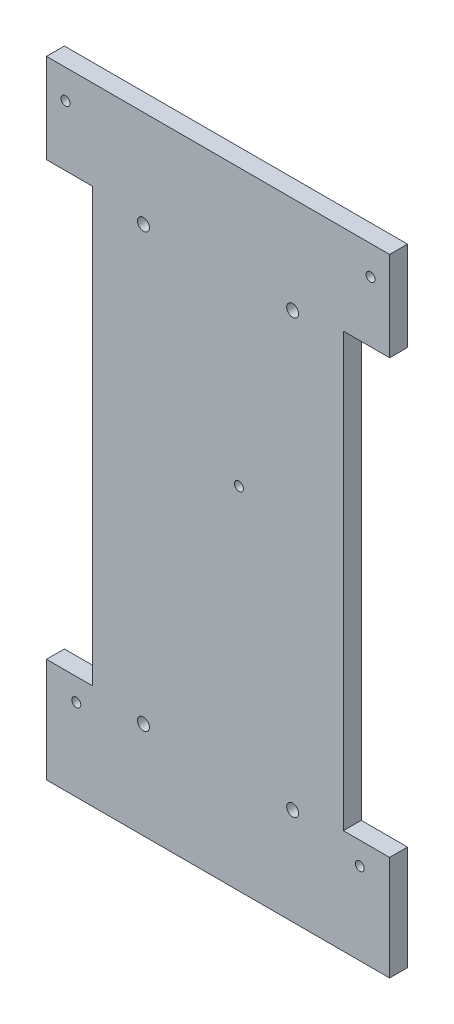
ISO-10303-21;
HEADER;
FILE_DESCRIPTION(('STEP AP214'),'2;1');
FILE_NAME('part.step','',(''),(''),'','','');
FILE_SCHEMA(('AUTOMOTIVE_DESIGN { 1 0 10303 214 1 1 1 1 }'));
ENDSEC;
DATA;
#1=APPLICATION_CONTEXT('core data for automotive mechanical design processes');
#2=APPLICATION_PROTOCOL_DEFINITION('international standard','automotive_design',2000,#1);
#3=PRODUCT_CONTEXT('',#1,'mechanical');
#4=PRODUCT('Part','Part','',(#3));
#5=PRODUCT_RELATED_PRODUCT_CATEGORY('part','',(#4));
#6=PRODUCT_DEFINITION_FORMATION('','',#4);
#7=PRODUCT_DEFINITION_CONTEXT('part definition',#1,'design');
#8=PRODUCT_DEFINITION('design','',#6,#7);
#9=PRODUCT_DEFINITION_SHAPE('','',#8);
#10=(LENGTH_UNIT() NAMED_UNIT(*) SI_UNIT(.MILLI.,.METRE.));
#11=(NAMED_UNIT(*) PLANE_ANGLE_UNIT() SI_UNIT($,.RADIAN.));
#12=(NAMED_UNIT(*) SI_UNIT($,.STERADIAN.) SOLID_ANGLE_UNIT());
#13=UNCERTAINTY_MEASURE_WITH_UNIT(LENGTH_MEASURE(1.E-05),#10,'distance_accuracy_value','');
#14=(GEOMETRIC_REPRESENTATION_CONTEXT(3) GLOBAL_UNCERTAINTY_ASSIGNED_CONTEXT((#13)) GLOBAL_UNIT_ASSIGNED_CONTEXT((#10,
#11,#12)) REPRESENTATION_CONTEXT('',''));
#15=CARTESIAN_POINT('',(0.,0.,0.));
#16=DIRECTION('',(0.,0.,1.));
#17=DIRECTION('',(1.,0.,0.));
#18=AXIS2_PLACEMENT_3D('',#15,#16,#17);
#19=CARTESIAN_POINT('',(0.,99.4374943307562,6.));
#20=DIRECTION('',(0.,-1.,0.));
#21=DIRECTION('',(0.,0.,-1.));
#22=AXIS2_PLACEMENT_3D('',#19,#20,#21);
#23=PLANE('',#22);
#24=DIRECTION('',(-1.,0.,0.));
#25=VECTOR('',#24,1.);
#26=CARTESIAN_POINT('',(0.,99.4374943307562,0.));
#27=LINE('',#26,#25);
#28=CARTESIAN_POINT('',(57.5,99.4374943307562,0.));
#29=VERTEX_POINT('',#28);
#30=CARTESIAN_POINT('',(41.9926373014392,99.4374943307562,0.));
#31=VERTEX_POINT('',#30);
#32=EDGE_CURVE('E183',#29,#31,#27,.T.);
#33=ORIENTED_EDGE('',*,*,#32,.F.);
#34=DIRECTION('',(0.,0.,-1.));
#35=VECTOR('',#34,1.);
#36=CARTESIAN_POINT('',(57.5,99.4374943307562,6.));
#37=LINE('',#36,#35);
#38=CARTESIAN_POINT('',(57.5,99.4374943307562,6.));
#39=VERTEX_POINT('',#38);
#40=EDGE_CURVE('E11',#39,#29,#37,.T.);
#41=ORIENTED_EDGE('',*,*,#40,.F.);
#42=DIRECTION('',(-1.,0.,0.));
#43=VECTOR('',#42,1.);
#44=CARTESIAN_POINT('',(0.,99.4374943307562,6.));
#45=LINE('',#44,#43);
#46=CARTESIAN_POINT('',(41.9926373014392,99.4374943307562,6.));
#47=VERTEX_POINT('',#46);
#48=EDGE_CURVE('E270',#39,#47,#45,.T.);
#49=ORIENTED_EDGE('',*,*,#48,.T.);
#50=DIRECTION('',(0.,0.,-1.));
#51=VECTOR('',#50,1.);
#52=CARTESIAN_POINT('',(41.9926373014392,99.4374943307562,6.));
#53=LINE('',#52,#51);
#54=EDGE_CURVE('E52',#47,#31,#53,.T.);
#55=ORIENTED_EDGE('',*,*,#54,.T.);
#56=EDGE_LOOP('',(#33,#41,#49,#55));
#57=FACE_BOUND('',#56,.T.);
#58=ADVANCED_FACE('F35',(#57),#23,.T.);
#59=CARTESIAN_POINT('',(57.4999999999999,0.,6.));
#60=DIRECTION('',(1.,0.,0.));
#61=DIRECTION('',(0.,1.,0.));
#62=AXIS2_PLACEMENT_3D('',#59,#60,#61);
#63=PLANE('',#62);
#64=DIRECTION('',(0.,-1.,0.));
#65=VECTOR('',#64,1.);
#66=CARTESIAN_POINT('',(57.4999999999999,0.,0.));
#67=LINE('',#66,#65);
#68=CARTESIAN_POINT('',(57.5,129.437494330756,0.));
#69=VERTEX_POINT('',#68);
#70=EDGE_CURVE('E185',#69,#29,#67,.T.);
#71=ORIENTED_EDGE('',*,*,#70,.F.);
#72=DIRECTION('',(0.,0.,-1.));
#73=VECTOR('',#72,1.);
#74=CARTESIAN_POINT('',(57.5,129.437494330756,6.));
#75=LINE('',#74,#73);
#76=CARTESIAN_POINT('',(57.5,129.437494330756,6.));
#77=VERTEX_POINT('',#76);
#78=EDGE_CURVE('E44',#77,#69,#75,.T.);
#79=ORIENTED_EDGE('',*,*,#78,.F.);
#80=DIRECTION('',(0.,-1.,0.));
#81=VECTOR('',#80,1.);
#82=CARTESIAN_POINT('',(57.4999999999999,0.,6.));
#83=LINE('',#82,#81);
#84=EDGE_CURVE('E268',#77,#39,#83,.T.);
#85=ORIENTED_EDGE('',*,*,#84,.T.);
#86=ORIENTED_EDGE('',*,*,#40,.T.);
#87=EDGE_LOOP('',(#71,#79,#85,#86));
#88=FACE_BOUND('',#87,.T.);
#89=ADVANCED_FACE('F254',(#88),#63,.T.);
#90=CARTESIAN_POINT('',(0.,129.437494330756,6.));
#91=DIRECTION('',(0.,1.,0.));
#92=DIRECTION('',(0.,0.,1.));
#93=AXIS2_PLACEMENT_3D('',#90,#91,#92);
#94=PLANE('',#93);
#95=DIRECTION('',(1.,0.,0.));
#96=VECTOR('',#95,1.);
#97=CARTESIAN_POINT('',(0.,129.437494330756,0.));
#98=LINE('',#97,#96);
#99=CARTESIAN_POINT('',(-57.5,129.437494330756,0.));
#100=VERTEX_POINT('',#99);
#101=EDGE_CURVE('E188',#100,#69,#98,.T.);
#102=ORIENTED_EDGE('',*,*,#101,.F.);
#103=DIRECTION('',(0.,0.,-1.));
#104=VECTOR('',#103,1.);
#105=CARTESIAN_POINT('',(-57.5,129.437494330756,6.));
#106=LINE('',#105,#104);
#107=CARTESIAN_POINT('',(-57.5,129.437494330756,6.));
#108=VERTEX_POINT('',#107);
#109=EDGE_CURVE('E243',#108,#100,#106,.T.);
#110=ORIENTED_EDGE('',*,*,#109,.F.);
#111=DIRECTION('',(1.,0.,0.));
#112=VECTOR('',#111,1.);
#113=CARTESIAN_POINT('',(0.,129.437494330756,6.));
#114=LINE('',#113,#112);
#115=EDGE_CURVE('E250',#108,#77,#114,.T.);
#116=ORIENTED_EDGE('',*,*,#115,.T.);
#117=ORIENTED_EDGE('',*,*,#78,.T.);
#118=EDGE_LOOP('',(#102,#110,#116,#117));
#119=FACE_BOUND('',#118,.T.);
#120=ADVANCED_FACE('F248',(#119),#94,.T.);
#121=CARTESIAN_POINT('',(-57.4999999999999,0.,6.));
#122=DIRECTION('',(1.,0.,0.));
#123=DIRECTION('',(0.,1.,0.));
#124=AXIS2_PLACEMENT_3D('',#121,#122,#123);
#125=PLANE('',#124);
#126=DIRECTION('',(0.,-1.,0.));
#127=VECTOR('',#126,1.);
#128=CARTESIAN_POINT('',(-57.4999999999999,0.,0.));
#129=LINE('',#128,#127);
#130=CARTESIAN_POINT('',(-57.5,99.4374943307562,0.));
#131=VERTEX_POINT('',#130);
#132=EDGE_CURVE('E191',#100,#131,#129,.T.);
#133=ORIENTED_EDGE('',*,*,#132,.T.);
#134=DIRECTION('',(0.,0.,-1.));
#135=VECTOR('',#134,1.);
#136=CARTESIAN_POINT('',(-57.5,99.4374943307562,6.));
#137=LINE('',#136,#135);
#138=CARTESIAN_POINT('',(-57.5,99.4374943307562,6.));
#139=VERTEX_POINT('',#138);
#140=EDGE_CURVE('E240',#139,#131,#137,.T.);
#141=ORIENTED_EDGE('',*,*,#140,.F.);
#142=DIRECTION('',(0.,-1.,0.));
#143=VECTOR('',#142,1.);
#144=CARTESIAN_POINT('',(-57.4999999999999,0.,6.));
#145=LINE('',#144,#143);
#146=EDGE_CURVE('E264',#108,#139,#145,.T.);
#147=ORIENTED_EDGE('',*,*,#146,.F.);
#148=ORIENTED_EDGE('',*,*,#109,.T.);
#149=EDGE_LOOP('',(#133,#141,#147,#148));
#150=FACE_BOUND('',#149,.T.);
#151=ADVANCED_FACE('F261',(#150),#125,.F.);
#152=CARTESIAN_POINT('',(0.,99.4374943307562,6.));
#153=DIRECTION('',(0.,1.,0.));
#154=DIRECTION('',(0.,0.,1.));
#155=AXIS2_PLACEMENT_3D('',#152,#153,#154);
#156=PLANE('',#155);
#157=DIRECTION('',(1.,0.,0.));
#158=VECTOR('',#157,1.);
#159=CARTESIAN_POINT('',(0.,99.4374943307562,0.));
#160=LINE('',#159,#158);
#161=CARTESIAN_POINT('',(-41.9926373014392,99.4374943307562,0.));
#162=VERTEX_POINT('',#161);
#163=EDGE_CURVE('E194',#131,#162,#160,.T.);
#164=ORIENTED_EDGE('',*,*,#163,.T.);
#165=DIRECTION('',(0.,0.,-1.));
#166=VECTOR('',#165,1.);
#167=CARTESIAN_POINT('',(-41.9926373014392,99.4374943307562,6.));
#168=LINE('',#167,#166);
#169=CARTESIAN_POINT('',(-41.9926373014392,99.4374943307562,6.));
#170=VERTEX_POINT('',#169);
#171=EDGE_CURVE('E237',#170,#162,#168,.T.);
#172=ORIENTED_EDGE('',*,*,#171,.F.);
#173=DIRECTION('',(1.,0.,0.));
#174=VECTOR('',#173,1.);
#175=CARTESIAN_POINT('',(0.,99.4374943307562,6.));
#176=LINE('',#175,#174);
#177=EDGE_CURVE('E266',#139,#170,#176,.T.);
#178=ORIENTED_EDGE('',*,*,#177,.F.);
#179=ORIENTED_EDGE('',*,*,#140,.T.);
#180=EDGE_LOOP('',(#164,#172,#178,#179));
#181=FACE_BOUND('',#180,.T.);
#182=ADVANCED_FACE('F480',(#181),#156,.F.);
#183=CARTESIAN_POINT('',(-41.9926373014392,0.,6.));
#184=DIRECTION('',(1.,0.,0.));
#185=DIRECTION('',(0.,1.,0.));
#186=AXIS2_PLACEMENT_3D('',#183,#184,#185);
#187=PLANE('',#186);
#188=DIRECTION('',(0.,-1.,0.));
#189=VECTOR('',#188,1.);
#190=CARTESIAN_POINT('',(-41.9926373014392,0.,0.));
#191=LINE('',#190,#189);
#192=CARTESIAN_POINT('',(-41.9926373014392,-45.5625056692438,0.));
#193=VERTEX_POINT('',#192);
#194=EDGE_CURVE('E197',#162,#193,#191,.T.);
#195=ORIENTED_EDGE('',*,*,#194,.T.);
#196=DIRECTION('',(0.,0.,-1.));
#197=VECTOR('',#196,1.);
#198=CARTESIAN_POINT('',(-41.9926373014392,-45.5625056692438,6.));
#199=LINE('',#198,#197);
#200=CARTESIAN_POINT('',(-41.9926373014392,-45.5625056692438,6.));
#201=VERTEX_POINT('',#200);
#202=EDGE_CURVE('E235',#201,#193,#199,.T.);
#203=ORIENTED_EDGE('',*,*,#202,.F.);
#204=DIRECTION('',(0.,-1.,0.));
#205=VECTOR('',#204,1.);
#206=CARTESIAN_POINT('',(-41.9926373014392,0.,6.));
#207=LINE('',#206,#205);
#208=EDGE_CURVE('E275',#170,#201,#207,.T.);
#209=ORIENTED_EDGE('',*,*,#208,.F.);
#210=ORIENTED_EDGE('',*,*,#171,.T.);
#211=EDGE_LOOP('',(#195,#203,#209,#210));
#212=FACE_BOUND('',#211,.T.);
#213=ADVANCED_FACE('F470',(#212),#187,.F.);
#214=CARTESIAN_POINT('',(0.,-45.5625056692438,6.));
#215=DIRECTION('',(0.,1.,0.));
#216=DIRECTION('',(0.,0.,1.));
#217=AXIS2_PLACEMENT_3D('',#214,#215,#216);
#218=PLANE('',#217);
#219=DIRECTION('',(1.,0.,0.));
#220=VECTOR('',#219,1.);
#221=CARTESIAN_POINT('',(0.,-45.5625056692438,0.));
#222=LINE('',#221,#220);
#223=CARTESIAN_POINT('',(-57.4999999999999,-45.5625056692438,0.));
#224=VERTEX_POINT('',#223);
#225=EDGE_CURVE('E200',#224,#193,#222,.T.);
#226=ORIENTED_EDGE('',*,*,#225,.F.);
#227=DIRECTION('',(0.,0.,-1.));
#228=VECTOR('',#227,1.);
#229=CARTESIAN_POINT('',(-57.4999999999999,-45.5625056692438,6.));
#230=LINE('',#229,#228);
#231=CARTESIAN_POINT('',(-57.4999999999999,-45.5625056692438,6.));
#232=VERTEX_POINT('',#231);
#233=EDGE_CURVE('E233',#232,#224,#230,.T.);
#234=ORIENTED_EDGE('',*,*,#233,.F.);
#235=DIRECTION('',(1.,0.,0.));
#236=VECTOR('',#235,1.);
#237=CARTESIAN_POINT('',(0.,-45.5625056692438,6.));
#238=LINE('',#237,#236);
#239=EDGE_CURVE('E277',#232,#201,#238,.T.);
#240=ORIENTED_EDGE('',*,*,#239,.T.);
#241=ORIENTED_EDGE('',*,*,#202,.T.);
#242=EDGE_LOOP('',(#226,#234,#240,#241));
#243=FACE_BOUND('',#242,.T.);
#244=ADVANCED_FACE('F287',(#243),#218,.T.);
#245=CARTESIAN_POINT('',(-57.4999999999999,0.,6.));
#246=DIRECTION('',(-1.,0.,0.));
#247=DIRECTION('',(0.,-1.,0.));
#248=AXIS2_PLACEMENT_3D('',#245,#246,#247);
#249=PLANE('',#248);
#250=DIRECTION('',(0.,1.,0.));
#251=VECTOR('',#250,1.);
#252=CARTESIAN_POINT('',(-57.4999999999999,0.,0.));
#253=LINE('',#252,#251);
#254=CARTESIAN_POINT('',(-57.5,-80.5625056692438,0.));
#255=VERTEX_POINT('',#254);
#256=EDGE_CURVE('E203',#255,#224,#253,.T.);
#257=ORIENTED_EDGE('',*,*,#256,.F.);
#258=DIRECTION('',(0.,0.,-1.));
#259=VECTOR('',#258,1.);
#260=CARTESIAN_POINT('',(-57.5,-80.5625056692438,6.));
#261=LINE('',#260,#259);
#262=CARTESIAN_POINT('',(-57.5,-80.5625056692438,6.));
#263=VERTEX_POINT('',#262);
#264=EDGE_CURVE('E231',#263,#255,#261,.T.);
#265=ORIENTED_EDGE('',*,*,#264,.F.);
#266=DIRECTION('',(0.,1.,0.));
#267=VECTOR('',#266,1.);
#268=CARTESIAN_POINT('',(-57.4999999999999,0.,6.));
#269=LINE('',#268,#267);
#270=EDGE_CURVE('E151',#263,#232,#269,.T.);
#271=ORIENTED_EDGE('',*,*,#270,.T.);
#272=ORIENTED_EDGE('',*,*,#233,.T.);
#273=EDGE_LOOP('',(#257,#265,#271,#272));
#274=FACE_BOUND('',#273,.T.);
#275=ADVANCED_FACE('F282',(#274),#249,.T.);
#276=CARTESIAN_POINT('',(0.,-80.5625056692438,6.));
#277=DIRECTION('',(0.,1.,0.));
#278=DIRECTION('',(-1.,0.,0.));
#279=AXIS2_PLACEMENT_3D('',#276,#277,#278);
#280=PLANE('',#279);
#281=DIRECTION('',(1.,0.,0.));
#282=VECTOR('',#281,1.);
#283=CARTESIAN_POINT('',(0.,-80.5625056692438,0.));
#284=LINE('',#283,#282);
#285=CARTESIAN_POINT('',(57.5000000000001,-80.5625056692438,0.));
#286=VERTEX_POINT('',#285);
#287=EDGE_CURVE('E206',#255,#286,#284,.T.);
#288=ORIENTED_EDGE('',*,*,#287,.T.);
#289=DIRECTION('',(0.,0.,-1.));
#290=VECTOR('',#289,1.);
#291=CARTESIAN_POINT('',(57.5000000000001,-80.5625056692438,6.));
#292=LINE('',#291,#290);
#293=CARTESIAN_POINT('',(57.5000000000001,-80.5625056692438,6.));
#294=VERTEX_POINT('',#293);
#295=EDGE_CURVE('E136',#294,#286,#292,.T.);
#296=ORIENTED_EDGE('',*,*,#295,.F.);
#297=DIRECTION('',(1.,0.,0.));
#298=VECTOR('',#297,1.);
#299=CARTESIAN_POINT('',(0.,-80.5625056692438,6.));
#300=LINE('',#299,#298);
#301=EDGE_CURVE('E148',#263,#294,#300,.T.);
#302=ORIENTED_EDGE('',*,*,#301,.F.);
#303=ORIENTED_EDGE('',*,*,#264,.T.);
#304=EDGE_LOOP('',(#288,#296,#302,#303));
#305=FACE_BOUND('',#304,.T.);
#306=ADVANCED_FACE('F290',(#305),#280,.F.);
#307=CARTESIAN_POINT('',(57.4999999999999,1.48194948376304E-13,6.));
#308=DIRECTION('',(1.,0.,0.));
#309=DIRECTION('',(0.,1.,0.));
#310=AXIS2_PLACEMENT_3D('',#307,#308,#309);
#311=PLANE('',#310);
#312=DIRECTION('',(0.,-1.,0.));
#313=VECTOR('',#312,1.);
#314=CARTESIAN_POINT('',(57.4999999999999,1.48194948376304E-13,0.));
#315=LINE('',#314,#313);
#316=CARTESIAN_POINT('',(57.5,-45.5625056692438,0.));
#317=VERTEX_POINT('',#316);
#318=EDGE_CURVE('E133',#317,#286,#315,.T.);
#319=ORIENTED_EDGE('',*,*,#318,.F.);
#320=DIRECTION('',(0.,0.,-1.));
#321=VECTOR('',#320,1.);
#322=CARTESIAN_POINT('',(57.5,-45.5625056692438,6.));
#323=LINE('',#322,#321);
#324=CARTESIAN_POINT('',(57.5,-45.5625056692438,6.));
#325=VERTEX_POINT('',#324);
#326=EDGE_CURVE('E127',#325,#317,#323,.T.);
#327=ORIENTED_EDGE('',*,*,#326,.F.);
#328=DIRECTION('',(0.,-1.,0.));
#329=VECTOR('',#328,1.);
#330=CARTESIAN_POINT('',(57.4999999999999,1.48194948376304E-13,6.));
#331=LINE('',#330,#329);
#332=EDGE_CURVE('E131',#325,#294,#331,.T.);
#333=ORIENTED_EDGE('',*,*,#332,.T.);
#334=ORIENTED_EDGE('',*,*,#295,.T.);
#335=EDGE_LOOP('',(#319,#327,#333,#334));
#336=FACE_BOUND('',#335,.T.);
#337=ADVANCED_FACE('F129',(#336),#311,.T.);
#338=CARTESIAN_POINT('',(0.,-45.5625056692438,6.));
#339=DIRECTION('',(0.,-1.,0.));
#340=DIRECTION('',(0.,0.,-1.));
#341=AXIS2_PLACEMENT_3D('',#338,#339,#340);
#342=PLANE('',#341);
#343=DIRECTION('',(-1.,0.,0.));
#344=VECTOR('',#343,1.);
#345=CARTESIAN_POINT('',(0.,-45.5625056692438,0.));
#346=LINE('',#345,#344);
#347=CARTESIAN_POINT('',(41.9926373014392,-45.5625056692438,0.));
#348=VERTEX_POINT('',#347);
#349=EDGE_CURVE('E210',#317,#348,#346,.T.);
#350=ORIENTED_EDGE('',*,*,#349,.T.);
#351=DIRECTION('',(0.,0.,-1.));
#352=VECTOR('',#351,1.);
#353=CARTESIAN_POINT('',(41.9926373014392,-45.5625056692438,6.));
#354=LINE('',#353,#352);
#355=CARTESIAN_POINT('',(41.9926373014392,-45.5625056692438,6.));
#356=VERTEX_POINT('',#355);
#357=EDGE_CURVE('E90',#356,#348,#354,.T.);
#358=ORIENTED_EDGE('',*,*,#357,.F.);
#359=DIRECTION('',(-1.,0.,0.));
#360=VECTOR('',#359,1.);
#361=CARTESIAN_POINT('',(0.,-45.5625056692438,6.));
#362=LINE('',#361,#360);
#363=EDGE_CURVE('E138',#325,#356,#362,.T.);
#364=ORIENTED_EDGE('',*,*,#363,.F.);
#365=ORIENTED_EDGE('',*,*,#326,.T.);
#366=EDGE_LOOP('',(#350,#358,#364,#365));
#367=FACE_BOUND('',#366,.T.);
#368=ADVANCED_FACE('F139',(#367),#342,.F.);
#369=CARTESIAN_POINT('',(-24.9999999999999,-48.0625056692438,6.));
#370=DIRECTION('',(0.,0.,-1.));
#371=DIRECTION('',(-1.,0.,0.));
#372=AXIS2_PLACEMENT_3D('',#369,#370,#371);
#373=CYLINDRICAL_SURFACE('',#372,2.);
#374=CARTESIAN_POINT('',(-24.9999999999999,-48.0625056692438,6.));
#375=DIRECTION('',(0.,0.,1.));
#376=DIRECTION('',(1.,0.,0.));
#377=AXIS2_PLACEMENT_3D('',#374,#375,#376);
#378=CIRCLE('',#377,2.);
#379=CARTESIAN_POINT('',(-22.9999999999999,-48.0625056692438,6.));
#380=VERTEX_POINT('',#379);
#381=EDGE_CURVE('E162',#380,#380,#378,.T.);
#382=ORIENTED_EDGE('',*,*,#381,.T.);
#383=EDGE_LOOP('',(#382));
#384=FACE_BOUND('',#383,.T.);
#385=CARTESIAN_POINT('',(-24.9999999999999,-48.0625056692438,0.));
#386=DIRECTION('',(0.,0.,1.));
#387=DIRECTION('',(1.,0.,0.));
#388=AXIS2_PLACEMENT_3D('',#385,#386,#387);
#389=CIRCLE('',#388,2.);
#390=CARTESIAN_POINT('',(-22.9999999999999,-48.0625056692438,0.));
#391=VERTEX_POINT('',#390);
#392=EDGE_CURVE('E221',#391,#391,#389,.T.);
#393=ORIENTED_EDGE('',*,*,#392,.F.);
#394=EDGE_LOOP('',(#393));
#395=FACE_BOUND('',#394,.T.);
#396=ADVANCED_FACE('F354',(#384,#395),#373,.F.);
#397=CARTESIAN_POINT('',(47.5,-53.0625056692438,6.));
#398=DIRECTION('',(0.,0.,-1.));
#399=DIRECTION('',(-1.,0.,0.));
#400=AXIS2_PLACEMENT_3D('',#397,#398,#399);
#401=CYLINDRICAL_SURFACE('',#400,1.5);
#402=CARTESIAN_POINT('',(47.5,-53.0625056692438,6.));
#403=DIRECTION('',(0.,0.,1.));
#404=DIRECTION('',(1.,0.,0.));
#405=AXIS2_PLACEMENT_3D('',#402,#403,#404);
#406=CIRCLE('',#405,1.5);
#407=CARTESIAN_POINT('',(49.,-53.0625056692438,6.));
#408=VERTEX_POINT('',#407);
#409=EDGE_CURVE('E159',#408,#408,#406,.F.);
#410=ORIENTED_EDGE('',*,*,#409,.F.);
#411=EDGE_LOOP('',(#410));
#412=FACE_BOUND('',#411,.T.);
#413=CARTESIAN_POINT('',(47.5,-53.0625056692438,0.));
#414=DIRECTION('',(0.,0.,1.));
#415=DIRECTION('',(1.,0.,0.));
#416=AXIS2_PLACEMENT_3D('',#413,#414,#415);
#417=CIRCLE('',#416,1.5);
#418=CARTESIAN_POINT('',(49.,-53.0625056692438,0.));
#419=VERTEX_POINT('',#418);
#420=EDGE_CURVE('E218',#419,#419,#417,.F.);
#421=ORIENTED_EDGE('',*,*,#420,.T.);
#422=EDGE_LOOP('',(#421));
#423=FACE_BOUND('',#422,.T.);
#424=ADVANCED_FACE('F357',(#412,#423),#401,.F.);
#425=CARTESIAN_POINT('',(-47.5,-53.0625056692438,6.));
#426=DIRECTION('',(0.,0.,-1.));
#427=DIRECTION('',(-1.,0.,0.));
#428=AXIS2_PLACEMENT_3D('',#425,#426,#427);
#429=CYLINDRICAL_SURFACE('',#428,1.5);
#430=CARTESIAN_POINT('',(-47.5,-53.0625056692438,6.));
#431=DIRECTION('',(0.,0.,1.));
#432=DIRECTION('',(1.,0.,0.));
#433=AXIS2_PLACEMENT_3D('',#430,#431,#432);
#434=CIRCLE('',#433,1.5);
#435=CARTESIAN_POINT('',(-46.,-53.0625056692438,6.));
#436=VERTEX_POINT('',#435);
#437=EDGE_CURVE('E156',#436,#436,#434,.T.);
#438=ORIENTED_EDGE('',*,*,#437,.T.);
#439=EDGE_LOOP('',(#438));
#440=FACE_BOUND('',#439,.T.);
#441=CARTESIAN_POINT('',(-47.5,-53.0625056692438,0.));
#442=DIRECTION('',(0.,0.,1.));
#443=DIRECTION('',(1.,0.,0.));
#444=AXIS2_PLACEMENT_3D('',#441,#442,#443);
#445=CIRCLE('',#444,1.5);
#446=CARTESIAN_POINT('',(-46.,-53.0625056692438,0.));
#447=VERTEX_POINT('',#446);
#448=EDGE_CURVE('E215',#447,#447,#445,.T.);
#449=ORIENTED_EDGE('',*,*,#448,.F.);
#450=EDGE_LOOP('',(#449));
#451=FACE_BOUND('',#450,.T.);
#452=ADVANCED_FACE('F361',(#440,#451),#429,.F.);
#453=CARTESIAN_POINT('',(41.9926373014392,0.,6.));
#454=DIRECTION('',(1.,0.,0.));
#455=DIRECTION('',(0.,1.,0.));
#456=AXIS2_PLACEMENT_3D('',#453,#454,#455);
#457=PLANE('',#456);
#458=DIRECTION('',(0.,-1.,0.));
#459=VECTOR('',#458,1.);
#460=CARTESIAN_POINT('',(41.9926373014392,0.,0.));
#461=LINE('',#460,#459);
#462=EDGE_CURVE('E212',#31,#348,#461,.T.);
#463=ORIENTED_EDGE('',*,*,#462,.F.);
#464=ORIENTED_EDGE('',*,*,#54,.F.);
#465=DIRECTION('',(0.,-1.,0.));
#466=VECTOR('',#465,1.);
#467=CARTESIAN_POINT('',(41.9926373014392,0.,6.));
#468=LINE('',#467,#466);
#469=EDGE_CURVE('E142',#47,#356,#468,.T.);
#470=ORIENTED_EDGE('',*,*,#469,.T.);
#471=ORIENTED_EDGE('',*,*,#357,.T.);
#472=EDGE_LOOP('',(#463,#464,#470,#471));
#473=FACE_BOUND('',#472,.T.);
#474=ADVANCED_FACE('F311',(#473),#457,.T.);
#475=CARTESIAN_POINT('',(-51.1056480309251,119.710621144413,6.));
#476=DIRECTION('',(0.,0.,-1.));
#477=DIRECTION('',(-1.,0.,0.));
#478=AXIS2_PLACEMENT_3D('',#475,#476,#477);
#479=CYLINDRICAL_SURFACE('',#478,1.5);
#480=CARTESIAN_POINT('',(-51.1056480309251,119.710621144413,6.));
#481=DIRECTION('',(0.,0.,1.));
#482=DIRECTION('',(1.,0.,0.));
#483=AXIS2_PLACEMENT_3D('',#480,#481,#482);
#484=CIRCLE('',#483,1.5);
#485=CARTESIAN_POINT('',(-49.6056480309251,119.710621144413,6.));
#486=VERTEX_POINT('',#485);
#487=EDGE_CURVE('E577',#486,#486,#484,.T.);
#488=ORIENTED_EDGE('',*,*,#487,.T.);
#489=EDGE_LOOP('',(#488));
#490=FACE_BOUND('',#489,.T.);
#491=CARTESIAN_POINT('',(-51.1056480309251,119.710621144413,0.));
#492=DIRECTION('',(0.,0.,1.));
#493=DIRECTION('',(1.,0.,0.));
#494=AXIS2_PLACEMENT_3D('',#491,#492,#493);
#495=CIRCLE('',#494,1.5);
#496=CARTESIAN_POINT('',(-49.6056480309251,119.710621144413,0.));
#497=VERTEX_POINT('',#496);
#498=EDGE_CURVE('E180',#497,#497,#495,.T.);
#499=ORIENTED_EDGE('',*,*,#498,.F.);
#500=EDGE_LOOP('',(#499));
#501=FACE_BOUND('',#500,.T.);
#502=ADVANCED_FACE('F307',(#490,#501),#479,.F.);
#503=CARTESIAN_POINT('',(51.1056480309252,119.710621144414,6.));
#504=DIRECTION('',(0.,0.,-1.));
#505=DIRECTION('',(-1.,0.,0.));
#506=AXIS2_PLACEMENT_3D('',#503,#504,#505);
#507=CYLINDRICAL_SURFACE('',#506,1.5);
#508=CARTESIAN_POINT('',(51.1056480309252,119.710621144414,6.));
#509=DIRECTION('',(0.,0.,1.));
#510=DIRECTION('',(1.,0.,0.));
#511=AXIS2_PLACEMENT_3D('',#508,#509,#510);
#512=CIRCLE('',#511,1.5);
#513=CARTESIAN_POINT('',(52.6056480309252,119.710621144414,6.));
#514=VERTEX_POINT('',#513);
#515=EDGE_CURVE('E574',#514,#514,#512,.F.);
#516=ORIENTED_EDGE('',*,*,#515,.F.);
#517=EDGE_LOOP('',(#516));
#518=FACE_BOUND('',#517,.T.);
#519=CARTESIAN_POINT('',(51.1056480309252,119.710621144414,0.));
#520=DIRECTION('',(0.,0.,1.));
#521=DIRECTION('',(1.,0.,0.));
#522=AXIS2_PLACEMENT_3D('',#519,#520,#521);
#523=CIRCLE('',#522,1.5);
#524=CARTESIAN_POINT('',(52.6056480309252,119.710621144414,0.));
#525=VERTEX_POINT('',#524);
#526=EDGE_CURVE('E177',#525,#525,#523,.F.);
#527=ORIENTED_EDGE('',*,*,#526,.T.);
#528=EDGE_LOOP('',(#527));
#529=FACE_BOUND('',#528,.T.);
#530=ADVANCED_FACE('F310',(#518,#529),#507,.F.);
#531=CARTESIAN_POINT('',(-25.,96.9392871585198,6.));
#532=DIRECTION('',(0.,0.,-1.));
#533=DIRECTION('',(-1.,0.,0.));
#534=AXIS2_PLACEMENT_3D('',#531,#532,#533);
#535=CYLINDRICAL_SURFACE('',#534,2.);
#536=CARTESIAN_POINT('',(-25.,96.9392871585198,6.));
#537=DIRECTION('',(0.,0.,1.));
#538=DIRECTION('',(1.,0.,0.));
#539=AXIS2_PLACEMENT_3D('',#536,#537,#538);
#540=CIRCLE('',#539,2.);
#541=CARTESIAN_POINT('',(-23.,96.9392871585198,6.));
#542=VERTEX_POINT('',#541);
#543=EDGE_CURVE('E570',#542,#542,#540,.T.);
#544=ORIENTED_EDGE('',*,*,#543,.T.);
#545=EDGE_LOOP('',(#544));
#546=FACE_BOUND('',#545,.T.);
#547=CARTESIAN_POINT('',(-25.,96.9392871585198,0.));
#548=DIRECTION('',(0.,0.,1.));
#549=DIRECTION('',(1.,0.,0.));
#550=AXIS2_PLACEMENT_3D('',#547,#548,#549);
#551=CIRCLE('',#550,2.);
#552=CARTESIAN_POINT('',(-23.,96.9392871585198,0.));
#553=VERTEX_POINT('',#552);
#554=EDGE_CURVE('E174',#553,#553,#551,.T.);
#555=ORIENTED_EDGE('',*,*,#554,.F.);
#556=EDGE_LOOP('',(#555));
#557=FACE_BOUND('',#556,.T.);
#558=ADVANCED_FACE('F315',(#546,#557),#535,.F.);
#559=CARTESIAN_POINT('',(25.,96.9392871585198,6.));
#560=DIRECTION('',(0.,0.,-1.));
#561=DIRECTION('',(-1.,0.,0.));
#562=AXIS2_PLACEMENT_3D('',#559,#560,#561);
#563=CYLINDRICAL_SURFACE('',#562,2.);
#564=CARTESIAN_POINT('',(25.,96.9392871585198,6.));
#565=DIRECTION('',(0.,0.,1.));
#566=DIRECTION('',(1.,0.,0.));
#567=AXIS2_PLACEMENT_3D('',#564,#565,#566);
#568=CIRCLE('',#567,2.);
#569=CARTESIAN_POINT('',(27.,96.9392871585198,6.));
#570=VERTEX_POINT('',#569);
#571=EDGE_CURVE('E330',#570,#570,#568,.F.);
#572=ORIENTED_EDGE('',*,*,#571,.F.);
#573=EDGE_LOOP('',(#572));
#574=FACE_BOUND('',#573,.T.);
#575=CARTESIAN_POINT('',(25.,96.9392871585198,0.));
#576=DIRECTION('',(0.,0.,1.));
#577=DIRECTION('',(1.,0.,0.));
#578=AXIS2_PLACEMENT_3D('',#575,#576,#577);
#579=CIRCLE('',#578,2.);
#580=CARTESIAN_POINT('',(27.,96.9392871585198,0.));
#581=VERTEX_POINT('',#580);
#582=EDGE_CURVE('E171',#581,#581,#579,.F.);
#583=ORIENTED_EDGE('',*,*,#582,.T.);
#584=EDGE_LOOP('',(#583));
#585=FACE_BOUND('',#584,.T.);
#586=ADVANCED_FACE('F318',(#574,#585),#563,.F.);
#587=CARTESIAN_POINT('',(7.00000000000005,36.9374943307562,6.));
#588=DIRECTION('',(0.,0.,-1.));
#589=DIRECTION('',(-1.,0.,0.));
#590=AXIS2_PLACEMENT_3D('',#587,#588,#589);
#591=CYLINDRICAL_SURFACE('',#590,1.5);
#592=CARTESIAN_POINT('',(7.00000000000005,36.9374943307562,6.));
#593=DIRECTION('',(0.,0.,1.));
#594=DIRECTION('',(1.,0.,0.));
#595=AXIS2_PLACEMENT_3D('',#592,#593,#594);
#596=CIRCLE('',#595,1.5);
#597=CARTESIAN_POINT('',(8.50000000000005,36.9374943307562,6.));
#598=VERTEX_POINT('',#597);
#599=EDGE_CURVE('E227',#598,#598,#596,.T.);
#600=ORIENTED_EDGE('',*,*,#599,.T.);
#601=EDGE_LOOP('',(#600));
#602=FACE_BOUND('',#601,.T.);
#603=CARTESIAN_POINT('',(7.00000000000005,36.9374943307562,0.));
#604=DIRECTION('',(0.,0.,1.));
#605=DIRECTION('',(1.,0.,0.));
#606=AXIS2_PLACEMENT_3D('',#603,#604,#605);
#607=CIRCLE('',#606,1.5);
#608=CARTESIAN_POINT('',(8.50000000000005,36.9374943307562,0.));
#609=VERTEX_POINT('',#608);
#610=EDGE_CURVE('E168',#609,#609,#607,.T.);
#611=ORIENTED_EDGE('',*,*,#610,.F.);
#612=EDGE_LOOP('',(#611));
#613=FACE_BOUND('',#612,.T.);
#614=ADVANCED_FACE('F37',(#602,#613),#591,.F.);
#615=CARTESIAN_POINT('',(25.,-48.0625056692438,6.));
#616=DIRECTION('',(0.,0.,-1.));
#617=DIRECTION('',(-1.,0.,0.));
#618=AXIS2_PLACEMENT_3D('',#615,#616,#617);
#619=CYLINDRICAL_SURFACE('',#618,2.);
#620=CARTESIAN_POINT('',(25.,-48.0625056692438,6.));
#621=DIRECTION('',(0.,0.,1.));
#622=DIRECTION('',(1.,0.,0.));
#623=AXIS2_PLACEMENT_3D('',#620,#621,#622);
#624=CIRCLE('',#623,2.);
#625=CARTESIAN_POINT('',(27.,-48.0625056692438,6.));
#626=VERTEX_POINT('',#625);
#627=EDGE_CURVE('E165',#626,#626,#624,.F.);
#628=ORIENTED_EDGE('',*,*,#627,.F.);
#629=EDGE_LOOP('',(#628));
#630=FACE_BOUND('',#629,.T.);
#631=CARTESIAN_POINT('',(25.,-48.0625056692438,0.));
#632=DIRECTION('',(0.,0.,1.));
#633=DIRECTION('',(1.,0.,0.));
#634=AXIS2_PLACEMENT_3D('',#631,#632,#633);
#635=CIRCLE('',#634,2.);
#636=CARTESIAN_POINT('',(27.,-48.0625056692438,0.));
#637=VERTEX_POINT('',#636);
#638=EDGE_CURVE('E224',#637,#637,#635,.F.);
#639=ORIENTED_EDGE('',*,*,#638,.T.);
#640=EDGE_LOOP('',(#639));
#641=FACE_BOUND('',#640,.T.);
#642=ADVANCED_FACE('F325',(#630,#641),#619,.F.);
#643=CARTESIAN_POINT('',(0.,0.,6.));
#644=DIRECTION('',(0.,0.,1.));
#645=DIRECTION('',(1.,0.,0.));
#646=AXIS2_PLACEMENT_3D('',#643,#644,#645);
#647=PLANE('',#646);
#648=ORIENTED_EDGE('',*,*,#599,.F.);
#649=EDGE_LOOP('',(#648));
#650=FACE_BOUND('',#649,.T.);
#651=ORIENTED_EDGE('',*,*,#571,.T.);
#652=EDGE_LOOP('',(#651));
#653=FACE_BOUND('',#652,.T.);
#654=ORIENTED_EDGE('',*,*,#543,.F.);
#655=EDGE_LOOP('',(#654));
#656=FACE_BOUND('',#655,.T.);
#657=ORIENTED_EDGE('',*,*,#515,.T.);
#658=EDGE_LOOP('',(#657));
#659=FACE_BOUND('',#658,.T.);
#660=ORIENTED_EDGE('',*,*,#487,.F.);
#661=EDGE_LOOP('',(#660));
#662=FACE_BOUND('',#661,.T.);
#663=ORIENTED_EDGE('',*,*,#48,.F.);
#664=ORIENTED_EDGE('',*,*,#84,.F.);
#665=ORIENTED_EDGE('',*,*,#115,.F.);
#666=ORIENTED_EDGE('',*,*,#146,.T.);
#667=ORIENTED_EDGE('',*,*,#177,.T.);
#668=ORIENTED_EDGE('',*,*,#208,.T.);
#669=ORIENTED_EDGE('',*,*,#239,.F.);
#670=ORIENTED_EDGE('',*,*,#270,.F.);
#671=ORIENTED_EDGE('',*,*,#301,.T.);
#672=ORIENTED_EDGE('',*,*,#332,.F.);
#673=ORIENTED_EDGE('',*,*,#363,.T.);
#674=ORIENTED_EDGE('',*,*,#469,.F.);
#675=EDGE_LOOP('',(#663,#664,#665,#666,#667,#668,#669,#670,#671,#672,#673,#674));
#676=FACE_BOUND('',#675,.T.);
#677=ORIENTED_EDGE('',*,*,#437,.F.);
#678=EDGE_LOOP('',(#677));
#679=FACE_BOUND('',#678,.T.);
#680=ORIENTED_EDGE('',*,*,#409,.T.);
#681=EDGE_LOOP('',(#680));
#682=FACE_BOUND('',#681,.T.);
#683=ORIENTED_EDGE('',*,*,#381,.F.);
#684=EDGE_LOOP('',(#683));
#685=FACE_BOUND('',#684,.T.);
#686=ORIENTED_EDGE('',*,*,#627,.T.);
#687=EDGE_LOOP('',(#686));
#688=FACE_BOUND('',#687,.T.);
#689=ADVANCED_FACE('F144',(#650,#653,#656,#659,#662,#676,#679,#682,#685,#688),#647,.T.);
#690=CARTESIAN_POINT('',(0.,0.,0.));
#691=DIRECTION('',(0.,0.,1.));
#692=DIRECTION('',(1.,0.,0.));
#693=AXIS2_PLACEMENT_3D('',#690,#691,#692);
#694=PLANE('',#693);
#695=ORIENTED_EDGE('',*,*,#610,.T.);
#696=EDGE_LOOP('',(#695));
#697=FACE_BOUND('',#696,.T.);
#698=ORIENTED_EDGE('',*,*,#582,.F.);
#699=EDGE_LOOP('',(#698));
#700=FACE_BOUND('',#699,.T.);
#701=ORIENTED_EDGE('',*,*,#554,.T.);
#702=EDGE_LOOP('',(#701));
#703=FACE_BOUND('',#702,.T.);
#704=ORIENTED_EDGE('',*,*,#526,.F.);
#705=EDGE_LOOP('',(#704));
#706=FACE_BOUND('',#705,.T.);
#707=ORIENTED_EDGE('',*,*,#498,.T.);
#708=EDGE_LOOP('',(#707));
#709=FACE_BOUND('',#708,.T.);
#710=ORIENTED_EDGE('',*,*,#32,.T.);
#711=ORIENTED_EDGE('',*,*,#462,.T.);
#712=ORIENTED_EDGE('',*,*,#349,.F.);
#713=ORIENTED_EDGE('',*,*,#318,.T.);
#714=ORIENTED_EDGE('',*,*,#287,.F.);
#715=ORIENTED_EDGE('',*,*,#256,.T.);
#716=ORIENTED_EDGE('',*,*,#225,.T.);
#717=ORIENTED_EDGE('',*,*,#194,.F.);
#718=ORIENTED_EDGE('',*,*,#163,.F.);
#719=ORIENTED_EDGE('',*,*,#132,.F.);
#720=ORIENTED_EDGE('',*,*,#101,.T.);
#721=ORIENTED_EDGE('',*,*,#70,.T.);
#722=EDGE_LOOP('',(#710,#711,#712,#713,#714,#715,#716,#717,#718,#719,#720,#721));
#723=FACE_BOUND('',#722,.T.);
#724=ORIENTED_EDGE('',*,*,#448,.T.);
#725=EDGE_LOOP('',(#724));
#726=FACE_BOUND('',#725,.T.);
#727=ORIENTED_EDGE('',*,*,#420,.F.);
#728=EDGE_LOOP('',(#727));
#729=FACE_BOUND('',#728,.T.);
#730=ORIENTED_EDGE('',*,*,#392,.T.);
#731=EDGE_LOOP('',(#730));
#732=FACE_BOUND('',#731,.T.);
#733=ORIENTED_EDGE('',*,*,#638,.F.);
#734=EDGE_LOOP('',(#733));
#735=FACE_BOUND('',#734,.T.);
#736=ADVANCED_FACE('F257',(#697,#700,#703,#706,#709,#723,#726,#729,#732,#735),#694,.F.);
#737=CLOSED_SHELL('',(#58,#89,#120,#151,#182,#213,#244,#275,#306,#337,#368,#396,#424,#452,#474,
#502,#530,#558,#586,#614,#642,#689,#736));
#738=MANIFOLD_SOLID_BREP('B2',#737);
#739=ADVANCED_BREP_SHAPE_REPRESENTATION('',(#18,#738),#14);
#740=SHAPE_DEFINITION_REPRESENTATION(#9,#739);
ENDSEC;
END-ISO-10303-21;
